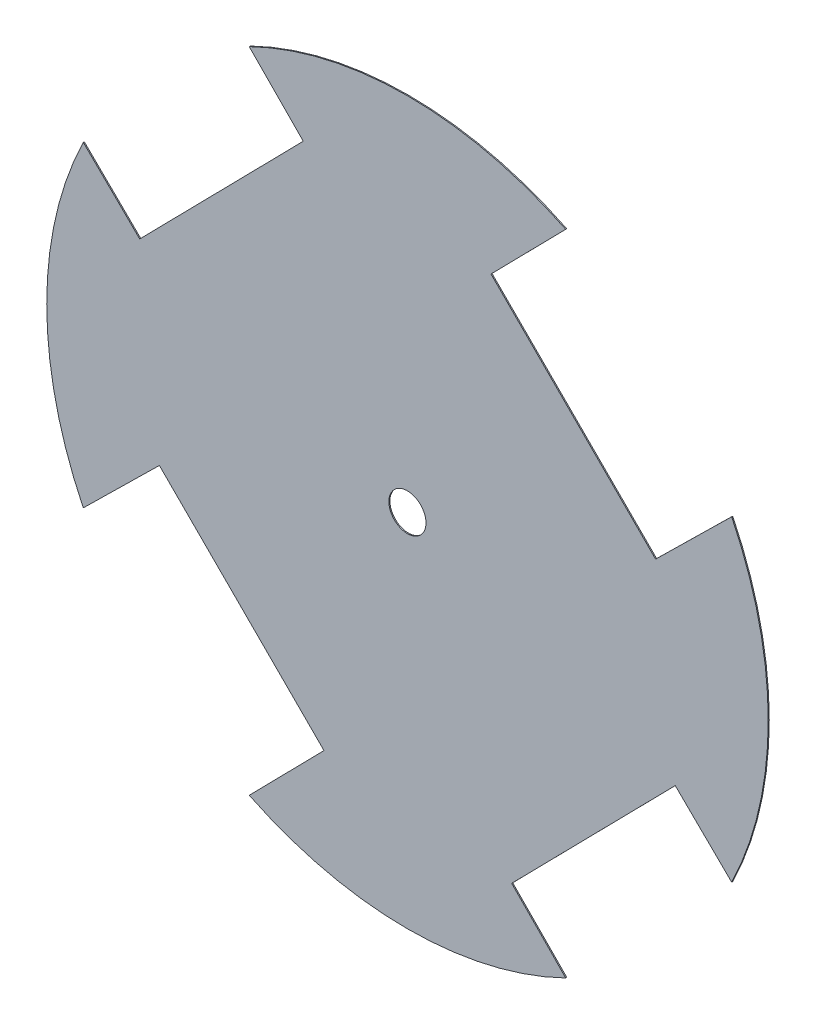
ISO-10303-21;
HEADER;
FILE_DESCRIPTION(('STEP AP214'),'2;1');
FILE_NAME('part.step','',(''),(''),'','','');
FILE_SCHEMA(('AUTOMOTIVE_DESIGN { 1 0 10303 214 1 1 1 1 }'));
ENDSEC;
DATA;
#1=APPLICATION_CONTEXT('core data for automotive mechanical design processes');
#2=APPLICATION_PROTOCOL_DEFINITION('international standard','automotive_design',2000,#1);
#3=PRODUCT_CONTEXT('',#1,'mechanical');
#4=PRODUCT('Part','Part','',(#3));
#5=PRODUCT_RELATED_PRODUCT_CATEGORY('part','',(#4));
#6=PRODUCT_DEFINITION_FORMATION('','',#4);
#7=PRODUCT_DEFINITION_CONTEXT('part definition',#1,'design');
#8=PRODUCT_DEFINITION('design','',#6,#7);
#9=PRODUCT_DEFINITION_SHAPE('','',#8);
#10=(LENGTH_UNIT() NAMED_UNIT(*) SI_UNIT(.MILLI.,.METRE.));
#11=(NAMED_UNIT(*) PLANE_ANGLE_UNIT() SI_UNIT($,.RADIAN.));
#12=(NAMED_UNIT(*) SI_UNIT($,.STERADIAN.) SOLID_ANGLE_UNIT());
#13=UNCERTAINTY_MEASURE_WITH_UNIT(LENGTH_MEASURE(1.E-05),#10,'distance_accuracy_value','');
#14=(GEOMETRIC_REPRESENTATION_CONTEXT(3) GLOBAL_UNCERTAINTY_ASSIGNED_CONTEXT((#13)) GLOBAL_UNIT_ASSIGNED_CONTEXT((#10,
#11,#12)) REPRESENTATION_CONTEXT('',''));
#15=CARTESIAN_POINT('',(0.,0.,0.));
#16=DIRECTION('',(0.,0.,1.));
#17=DIRECTION('',(1.,0.,0.));
#18=AXIS2_PLACEMENT_3D('',#15,#16,#17);
#19=CARTESIAN_POINT('',(0.257754176952285,-1.11022302462516E-13,5.));
#20=DIRECTION('',(0.,0.,-1.));
#21=DIRECTION('',(-1.,0.,0.));
#22=AXIS2_PLACEMENT_3D('',#19,#20,#21);
#23=CYLINDRICAL_SURFACE('',#22,1750.);
#24=CARTESIAN_POINT('',(0.257754176952285,-1.11022302462516E-13,0.));
#25=DIRECTION('',(0.,0.,1.));
#26=DIRECTION('',(1.,0.,0.));
#27=AXIS2_PLACEMENT_3D('',#24,#25,#26);
#28=CIRCLE('',#27,1750.);
#29=CARTESIAN_POINT('',(-767.432407228817,-1572.62577114862,0.));
#30=VERTEX_POINT('',#29);
#31=CARTESIAN_POINT('',(767.947915582713,-1572.62577114862,0.));
#32=VERTEX_POINT('',#31);
#33=EDGE_CURVE('E187',#30,#32,#28,.T.);
#34=ORIENTED_EDGE('',*,*,#33,.T.);
#35=DIRECTION('',(0.,0.,-1.));
#36=VECTOR('',#35,1.);
#37=CARTESIAN_POINT('',(767.947915582713,-1572.62577114862,5.));
#38=LINE('',#37,#36);
#39=CARTESIAN_POINT('',(767.947915582713,-1572.62577114862,5.));
#40=VERTEX_POINT('',#39);
#41=EDGE_CURVE('E11',#40,#32,#38,.T.);
#42=ORIENTED_EDGE('',*,*,#41,.F.);
#43=CARTESIAN_POINT('',(0.257754176952285,-1.11022302462516E-13,5.));
#44=DIRECTION('',(0.,0.,1.));
#45=DIRECTION('',(1.,0.,0.));
#46=AXIS2_PLACEMENT_3D('',#43,#44,#45);
#47=CIRCLE('',#46,1750.);
#48=CARTESIAN_POINT('',(-767.432407228817,-1572.62577114862,5.));
#49=VERTEX_POINT('',#48);
#50=EDGE_CURVE('E234',#49,#40,#47,.T.);
#51=ORIENTED_EDGE('',*,*,#50,.F.);
#52=DIRECTION('',(0.,0.,-1.));
#53=VECTOR('',#52,1.);
#54=CARTESIAN_POINT('',(-767.432407228817,-1572.62577114862,5.));
#55=LINE('',#54,#53);
#56=EDGE_CURVE('E183',#49,#30,#55,.T.);
#57=ORIENTED_EDGE('',*,*,#56,.T.);
#58=EDGE_LOOP('',(#34,#42,#51,#57));
#59=FACE_BOUND('',#58,.T.);
#60=ADVANCED_FACE('F38',(#59),#23,.T.);
#61=CARTESIAN_POINT('',(767.947915582713,-1572.62577114862,5.));
#62=DIRECTION('',(-0.713235928626322,-0.700924040190197,0.));
#63=DIRECTION('',(0.700924040190197,-0.713235928626322,0.));
#64=AXIS2_PLACEMENT_3D('',#61,#62,#63);
#65=PLANE('',#64);
#66=DIRECTION('',(-0.700924040190197,0.713235928626322,0.));
#67=VECTOR('',#66,1.);
#68=CARTESIAN_POINT('',(767.947915582713,-1572.62577114862,0.));
#69=LINE('',#68,#67);
#70=CARTESIAN_POINT('',(505.906479136925,-1305.98151792644,0.));
#71=VERTEX_POINT('',#70);
#72=EDGE_CURVE('E191',#32,#71,#69,.T.);
#73=ORIENTED_EDGE('',*,*,#72,.T.);
#74=DIRECTION('',(0.,0.,-1.));
#75=VECTOR('',#74,1.);
#76=CARTESIAN_POINT('',(505.906479136925,-1305.98151792644,5.));
#77=LINE('',#76,#75);
#78=CARTESIAN_POINT('',(505.906479136925,-1305.98151792644,5.));
#79=VERTEX_POINT('',#78);
#80=EDGE_CURVE('E47',#79,#71,#77,.T.);
#81=ORIENTED_EDGE('',*,*,#80,.F.);
#82=DIRECTION('',(-0.700924040190197,0.713235928626322,0.));
#83=VECTOR('',#82,1.);
#84=CARTESIAN_POINT('',(767.947915582713,-1572.62577114862,5.));
#85=LINE('',#84,#83);
#86=EDGE_CURVE('E122',#40,#79,#85,.T.);
#87=ORIENTED_EDGE('',*,*,#86,.F.);
#88=ORIENTED_EDGE('',*,*,#41,.T.);
#89=EDGE_LOOP('',(#73,#81,#87,#88));
#90=FACE_BOUND('',#89,.T.);
#91=ADVANCED_FACE('F358',(#90),#65,.F.);
#92=CARTESIAN_POINT('',(505.906479136925,-1305.98151792644,5.));
#93=DIRECTION('',(-0.713235928626318,0.700924040190201,0.));
#94=DIRECTION('',(-0.700924040190201,-0.713235928626318,0.));
#95=AXIS2_PLACEMENT_3D('',#92,#93,#94);
#96=PLANE('',#95);
#97=DIRECTION('',(0.700924040190201,0.713235928626318,0.));
#98=VECTOR('',#97,1.);
#99=CARTESIAN_POINT('',(505.906479136925,-1305.98151792644,0.));
#100=LINE('',#99,#98);
#101=CARTESIAN_POINT('',(1299.21132480927,-498.742094188975,0.));
#102=VERTEX_POINT('',#101);
#103=EDGE_CURVE('E195',#71,#102,#100,.T.);
#104=ORIENTED_EDGE('',*,*,#103,.T.);
#105=DIRECTION('',(0.,0.,-1.));
#106=VECTOR('',#105,1.);
#107=CARTESIAN_POINT('',(1299.21132480927,-498.742094188975,5.));
#108=LINE('',#107,#106);
#109=CARTESIAN_POINT('',(1299.21132480927,-498.742094188975,5.));
#110=VERTEX_POINT('',#109);
#111=EDGE_CURVE('E277',#110,#102,#108,.T.);
#112=ORIENTED_EDGE('',*,*,#111,.F.);
#113=DIRECTION('',(0.700924040190201,0.713235928626318,0.));
#114=VECTOR('',#113,1.);
#115=CARTESIAN_POINT('',(505.906479136925,-1305.98151792644,5.));
#116=LINE('',#115,#114);
#117=EDGE_CURVE('E287',#79,#110,#116,.T.);
#118=ORIENTED_EDGE('',*,*,#117,.F.);
#119=ORIENTED_EDGE('',*,*,#80,.T.);
#120=EDGE_LOOP('',(#104,#112,#118,#119));
#121=FACE_BOUND('',#120,.T.);
#122=ADVANCED_FACE('F285',(#121),#96,.F.);
#123=CARTESIAN_POINT('',(1299.21132480927,-498.742094188975,5.));
#124=DIRECTION('',(0.700924040190201,0.713235928626317,0.));
#125=DIRECTION('',(-0.713235928626317,0.700924040190201,0.));
#126=AXIS2_PLACEMENT_3D('',#123,#124,#125);
#127=PLANE('',#126);
#128=DIRECTION('',(0.713235928626317,-0.700924040190201,0.));
#129=VECTOR('',#128,1.);
#130=CARTESIAN_POINT('',(1299.21132480927,-498.742094188975,0.));
#131=LINE('',#130,#129);
#132=CARTESIAN_POINT('',(1572.88352532557,-767.69016140577,0.));
#133=VERTEX_POINT('',#132);
#134=EDGE_CURVE('E198',#102,#133,#131,.T.);
#135=ORIENTED_EDGE('',*,*,#134,.T.);
#136=DIRECTION('',(0.,0.,-1.));
#137=VECTOR('',#136,1.);
#138=CARTESIAN_POINT('',(1572.88352532557,-767.69016140577,5.));
#139=LINE('',#138,#137);
#140=CARTESIAN_POINT('',(1572.88352532557,-767.69016140577,5.));
#141=VERTEX_POINT('',#140);
#142=EDGE_CURVE('E273',#141,#133,#139,.T.);
#143=ORIENTED_EDGE('',*,*,#142,.F.);
#144=DIRECTION('',(0.713235928626317,-0.700924040190201,0.));
#145=VECTOR('',#144,1.);
#146=CARTESIAN_POINT('',(1299.21132480927,-498.742094188975,5.));
#147=LINE('',#146,#145);
#148=EDGE_CURVE('E306',#110,#141,#147,.T.);
#149=ORIENTED_EDGE('',*,*,#148,.F.);
#150=ORIENTED_EDGE('',*,*,#111,.T.);
#151=EDGE_LOOP('',(#135,#143,#149,#150));
#152=FACE_BOUND('',#151,.T.);
#153=ADVANCED_FACE('F296',(#152),#127,.F.);
#154=CARTESIAN_POINT('',(0.257754176952285,-1.11022302462516E-13,5.));
#155=DIRECTION('',(0.,0.,-1.));
#156=DIRECTION('',(-1.,0.,0.));
#157=AXIS2_PLACEMENT_3D('',#154,#155,#156);
#158=CYLINDRICAL_SURFACE('',#157,1750.);
#159=CARTESIAN_POINT('',(0.257754176952285,-1.11022302462516E-13,0.));
#160=DIRECTION('',(0.,0.,1.));
#161=DIRECTION('',(1.,0.,0.));
#162=AXIS2_PLACEMENT_3D('',#159,#160,#161);
#163=CIRCLE('',#162,1750.);
#164=CARTESIAN_POINT('',(1572.88352532565,767.690161405613,0.));
#165=VERTEX_POINT('',#164);
#166=EDGE_CURVE('E201',#133,#165,#163,.T.);
#167=ORIENTED_EDGE('',*,*,#166,.T.);
#168=DIRECTION('',(0.,0.,-1.));
#169=VECTOR('',#168,1.);
#170=CARTESIAN_POINT('',(1572.88352532565,767.690161405613,5.));
#171=LINE('',#170,#169);
#172=CARTESIAN_POINT('',(1572.88352532565,767.690161405613,5.));
#173=VERTEX_POINT('',#172);
#174=EDGE_CURVE('E269',#173,#165,#171,.T.);
#175=ORIENTED_EDGE('',*,*,#174,.F.);
#176=CARTESIAN_POINT('',(0.257754176952285,-1.11022302462516E-13,5.));
#177=DIRECTION('',(0.,0.,1.));
#178=DIRECTION('',(1.,0.,0.));
#179=AXIS2_PLACEMENT_3D('',#176,#177,#178);
#180=CIRCLE('',#179,1750.);
#181=EDGE_CURVE('E302',#141,#173,#180,.T.);
#182=ORIENTED_EDGE('',*,*,#181,.F.);
#183=ORIENTED_EDGE('',*,*,#142,.T.);
#184=EDGE_LOOP('',(#167,#175,#182,#183));
#185=FACE_BOUND('',#184,.T.);
#186=ADVANCED_FACE('F300',(#185),#158,.T.);
#187=CARTESIAN_POINT('',(1572.88352532565,767.690161405613,5.));
#188=DIRECTION('',(0.700924040190196,-0.713235928626322,0.));
#189=DIRECTION('',(0.713235928626322,0.700924040190197,0.));
#190=AXIS2_PLACEMENT_3D('',#187,#188,#189);
#191=PLANE('',#190);
#192=DIRECTION('',(-0.713235928626322,-0.700924040190196,0.));
#193=VECTOR('',#192,1.);
#194=CARTESIAN_POINT('',(1572.88352532565,767.690161405613,0.));
#195=LINE('',#194,#193);
#196=CARTESIAN_POINT('',(1203.82957372892,405.006824210943,0.));
#197=VERTEX_POINT('',#196);
#198=EDGE_CURVE('E204',#165,#197,#195,.T.);
#199=ORIENTED_EDGE('',*,*,#198,.T.);
#200=DIRECTION('',(0.,0.,-1.));
#201=VECTOR('',#200,1.);
#202=CARTESIAN_POINT('',(1203.82957372892,405.006824210943,5.));
#203=LINE('',#202,#201);
#204=CARTESIAN_POINT('',(1203.82957372892,405.006824210943,5.));
#205=VERTEX_POINT('',#204);
#206=EDGE_CURVE('E265',#205,#197,#203,.T.);
#207=ORIENTED_EDGE('',*,*,#206,.F.);
#208=DIRECTION('',(-0.713235928626322,-0.700924040190196,0.));
#209=VECTOR('',#208,1.);
#210=CARTESIAN_POINT('',(1572.88352532565,767.690161405613,5.));
#211=LINE('',#210,#209);
#212=EDGE_CURVE('E305',#173,#205,#211,.T.);
#213=ORIENTED_EDGE('',*,*,#212,.F.);
#214=ORIENTED_EDGE('',*,*,#174,.T.);
#215=EDGE_LOOP('',(#199,#207,#213,#214));
#216=FACE_BOUND('',#215,.T.);
#217=ADVANCED_FACE('F371',(#216),#191,.F.);
#218=CARTESIAN_POINT('',(1203.82957372892,405.006824210943,5.));
#219=DIRECTION('',(-0.707106781186547,-0.707106781186548,0.));
#220=DIRECTION('',(0.707106781186548,-0.707106781186547,0.));
#221=AXIS2_PLACEMENT_3D('',#218,#219,#220);
#222=PLANE('',#221);
#223=DIRECTION('',(-0.707106781186548,0.707106781186547,0.));
#224=VECTOR('',#223,1.);
#225=CARTESIAN_POINT('',(1203.82957372892,405.006824210943,0.));
#226=LINE('',#225,#224);
#227=CARTESIAN_POINT('',(405.264578388122,1203.57181955174,0.));
#228=VERTEX_POINT('',#227);
#229=EDGE_CURVE('E207',#197,#228,#226,.T.);
#230=ORIENTED_EDGE('',*,*,#229,.T.);
#231=DIRECTION('',(0.,0.,-1.));
#232=VECTOR('',#231,1.);
#233=CARTESIAN_POINT('',(405.264578388122,1203.57181955174,5.));
#234=LINE('',#233,#232);
#235=CARTESIAN_POINT('',(405.264578388122,1203.57181955174,5.));
#236=VERTEX_POINT('',#235);
#237=EDGE_CURVE('E261',#236,#228,#234,.T.);
#238=ORIENTED_EDGE('',*,*,#237,.F.);
#239=DIRECTION('',(-0.707106781186548,0.707106781186547,0.));
#240=VECTOR('',#239,1.);
#241=CARTESIAN_POINT('',(1203.82957372892,405.006824210943,5.));
#242=LINE('',#241,#240);
#243=EDGE_CURVE('E310',#205,#236,#242,.T.);
#244=ORIENTED_EDGE('',*,*,#243,.F.);
#245=ORIENTED_EDGE('',*,*,#206,.T.);
#246=EDGE_LOOP('',(#230,#238,#244,#245));
#247=FACE_BOUND('',#246,.T.);
#248=ADVANCED_FACE('F374',(#247),#222,.F.);
#249=CARTESIAN_POINT('',(405.264578388122,1203.57181955174,5.));
#250=DIRECTION('',(-0.713235928626318,0.7009240401902,0.));
#251=DIRECTION('',(-0.7009240401902,-0.713235928626318,0.));
#252=AXIS2_PLACEMENT_3D('',#249,#250,#251);
#253=PLANE('',#252);
#254=DIRECTION('',(0.7009240401902,0.713235928626318,0.));
#255=VECTOR('',#254,1.);
#256=CARTESIAN_POINT('',(405.264578388122,1203.57181955174,0.));
#257=LINE('',#256,#255);
#258=CARTESIAN_POINT('',(767.947915582871,1572.62577114854,0.));
#259=VERTEX_POINT('',#258);
#260=EDGE_CURVE('E210',#228,#259,#257,.T.);
#261=ORIENTED_EDGE('',*,*,#260,.T.);
#262=DIRECTION('',(0.,0.,-1.));
#263=VECTOR('',#262,1.);
#264=CARTESIAN_POINT('',(767.947915582871,1572.62577114854,5.));
#265=LINE('',#264,#263);
#266=CARTESIAN_POINT('',(767.947915582871,1572.62577114854,5.));
#267=VERTEX_POINT('',#266);
#268=EDGE_CURVE('E257',#267,#259,#265,.T.);
#269=ORIENTED_EDGE('',*,*,#268,.F.);
#270=DIRECTION('',(0.7009240401902,0.713235928626318,0.));
#271=VECTOR('',#270,1.);
#272=CARTESIAN_POINT('',(405.264578388122,1203.57181955174,5.));
#273=LINE('',#272,#271);
#274=EDGE_CURVE('E317',#236,#267,#273,.T.);
#275=ORIENTED_EDGE('',*,*,#274,.F.);
#276=ORIENTED_EDGE('',*,*,#237,.T.);
#277=EDGE_LOOP('',(#261,#269,#275,#276));
#278=FACE_BOUND('',#277,.T.);
#279=ADVANCED_FACE('F378',(#278),#253,.F.);
#280=CARTESIAN_POINT('',(0.257754176952285,-1.11022302462516E-13,5.));
#281=DIRECTION('',(0.,0.,-1.));
#282=DIRECTION('',(-1.,0.,0.));
#283=AXIS2_PLACEMENT_3D('',#280,#281,#282);
#284=CYLINDRICAL_SURFACE('',#283,1750.);
#285=CARTESIAN_POINT('',(0.257754176952285,-1.11022302462516E-13,0.));
#286=DIRECTION('',(0.,0.,1.));
#287=DIRECTION('',(1.,0.,0.));
#288=AXIS2_PLACEMENT_3D('',#285,#286,#287);
#289=CIRCLE('',#288,1750.);
#290=CARTESIAN_POINT('',(-767.432407228796,1572.62577114863,0.));
#291=VERTEX_POINT('',#290);
#292=EDGE_CURVE('E213',#259,#291,#289,.T.);
#293=ORIENTED_EDGE('',*,*,#292,.T.);
#294=DIRECTION('',(0.,0.,-1.));
#295=VECTOR('',#294,1.);
#296=CARTESIAN_POINT('',(-767.432407228796,1572.62577114863,5.));
#297=LINE('',#296,#295);
#298=CARTESIAN_POINT('',(-767.432407228796,1572.62577114863,5.));
#299=VERTEX_POINT('',#298);
#300=EDGE_CURVE('E253',#299,#291,#297,.T.);
#301=ORIENTED_EDGE('',*,*,#300,.F.);
#302=CARTESIAN_POINT('',(0.257754176952285,-1.11022302462516E-13,5.));
#303=DIRECTION('',(0.,0.,1.));
#304=DIRECTION('',(1.,0.,0.));
#305=AXIS2_PLACEMENT_3D('',#302,#303,#304);
#306=CIRCLE('',#305,1750.);
#307=EDGE_CURVE('E320',#267,#299,#306,.T.);
#308=ORIENTED_EDGE('',*,*,#307,.F.);
#309=ORIENTED_EDGE('',*,*,#268,.T.);
#310=EDGE_LOOP('',(#293,#301,#308,#309));
#311=FACE_BOUND('',#310,.T.);
#312=ADVANCED_FACE('F382',(#311),#284,.T.);
#313=CARTESIAN_POINT('',(-767.432407228797,1572.62577114863,5.));
#314=DIRECTION('',(0.713235928626327,0.700924040190192,0.));
#315=DIRECTION('',(-0.700924040190192,0.713235928626327,0.));
#316=AXIS2_PLACEMENT_3D('',#313,#314,#315);
#317=PLANE('',#316);
#318=DIRECTION('',(0.700924040190192,-0.713235928626327,0.));
#319=VECTOR('',#318,1.);
#320=CARTESIAN_POINT('',(-767.432407228797,1572.62577114863,0.));
#321=LINE('',#320,#319);
#322=CARTESIAN_POINT('',(-505.39097078301,1305.98151792645,0.));
#323=VERTEX_POINT('',#322);
#324=EDGE_CURVE('E216',#291,#323,#321,.T.);
#325=ORIENTED_EDGE('',*,*,#324,.T.);
#326=DIRECTION('',(0.,0.,-1.));
#327=VECTOR('',#326,1.);
#328=CARTESIAN_POINT('',(-505.39097078301,1305.98151792645,5.));
#329=LINE('',#328,#327);
#330=CARTESIAN_POINT('',(-505.39097078301,1305.98151792645,5.));
#331=VERTEX_POINT('',#330);
#332=EDGE_CURVE('E249',#331,#323,#329,.T.);
#333=ORIENTED_EDGE('',*,*,#332,.F.);
#334=DIRECTION('',(0.700924040190192,-0.713235928626327,0.));
#335=VECTOR('',#334,1.);
#336=CARTESIAN_POINT('',(-767.432407228797,1572.62577114863,5.));
#337=LINE('',#336,#335);
#338=EDGE_CURVE('E323',#299,#331,#337,.T.);
#339=ORIENTED_EDGE('',*,*,#338,.F.);
#340=ORIENTED_EDGE('',*,*,#300,.T.);
#341=EDGE_LOOP('',(#325,#333,#339,#340));
#342=FACE_BOUND('',#341,.T.);
#343=ADVANCED_FACE('F386',(#342),#317,.F.);
#344=CARTESIAN_POINT('',(-505.39097078301,1305.98151792645,5.));
#345=DIRECTION('',(0.713235928626313,-0.700924040190206,0.));
#346=DIRECTION('',(0.700924040190206,0.713235928626313,0.));
#347=AXIS2_PLACEMENT_3D('',#344,#345,#346);
#348=PLANE('',#347);
#349=DIRECTION('',(-0.700924040190206,-0.713235928626313,0.));
#350=VECTOR('',#349,1.);
#351=CARTESIAN_POINT('',(-505.39097078301,1305.98151792645,0.));
#352=LINE('',#351,#350);
#353=CARTESIAN_POINT('',(-1298.69581645537,498.742094188982,0.));
#354=VERTEX_POINT('',#353);
#355=EDGE_CURVE('E219',#323,#354,#352,.T.);
#356=ORIENTED_EDGE('',*,*,#355,.T.);
#357=DIRECTION('',(0.,0.,-1.));
#358=VECTOR('',#357,1.);
#359=CARTESIAN_POINT('',(-1298.69581645537,498.742094188982,5.));
#360=LINE('',#359,#358);
#361=CARTESIAN_POINT('',(-1298.69581645537,498.742094188982,5.));
#362=VERTEX_POINT('',#361);
#363=EDGE_CURVE('E245',#362,#354,#360,.T.);
#364=ORIENTED_EDGE('',*,*,#363,.F.);
#365=DIRECTION('',(-0.700924040190206,-0.713235928626313,0.));
#366=VECTOR('',#365,1.);
#367=CARTESIAN_POINT('',(-505.39097078301,1305.98151792645,5.));
#368=LINE('',#367,#366);
#369=EDGE_CURVE('E326',#331,#362,#368,.T.);
#370=ORIENTED_EDGE('',*,*,#369,.F.);
#371=ORIENTED_EDGE('',*,*,#332,.T.);
#372=EDGE_LOOP('',(#356,#364,#370,#371));
#373=FACE_BOUND('',#372,.T.);
#374=ADVANCED_FACE('F390',(#373),#348,.F.);
#375=CARTESIAN_POINT('',(-1298.69581645537,498.742094188982,5.));
#376=DIRECTION('',(-0.700924040190206,-0.713235928626312,0.));
#377=DIRECTION('',(0.713235928626312,-0.700924040190206,0.));
#378=AXIS2_PLACEMENT_3D('',#375,#376,#377);
#379=PLANE('',#378);
#380=DIRECTION('',(-0.713235928626312,0.700924040190206,0.));
#381=VECTOR('',#380,1.);
#382=CARTESIAN_POINT('',(-1298.69581645537,498.742094188982,0.));
#383=LINE('',#382,#381);
#384=CARTESIAN_POINT('',(-1572.36801697166,767.690161405779,0.));
#385=VERTEX_POINT('',#384);
#386=EDGE_CURVE('E222',#354,#385,#383,.T.);
#387=ORIENTED_EDGE('',*,*,#386,.T.);
#388=DIRECTION('',(0.,0.,-1.));
#389=VECTOR('',#388,1.);
#390=CARTESIAN_POINT('',(-1572.36801697166,767.690161405779,5.));
#391=LINE('',#390,#389);
#392=CARTESIAN_POINT('',(-1572.36801697166,767.690161405779,5.));
#393=VERTEX_POINT('',#392);
#394=EDGE_CURVE('E241',#393,#385,#391,.T.);
#395=ORIENTED_EDGE('',*,*,#394,.F.);
#396=DIRECTION('',(-0.713235928626312,0.700924040190206,0.));
#397=VECTOR('',#396,1.);
#398=CARTESIAN_POINT('',(-1298.69581645537,498.742094188982,5.));
#399=LINE('',#398,#397);
#400=EDGE_CURVE('E329',#362,#393,#399,.T.);
#401=ORIENTED_EDGE('',*,*,#400,.F.);
#402=ORIENTED_EDGE('',*,*,#363,.T.);
#403=EDGE_LOOP('',(#387,#395,#401,#402));
#404=FACE_BOUND('',#403,.T.);
#405=ADVANCED_FACE('F337',(#404),#379,.F.);
#406=CARTESIAN_POINT('',(0.257754176952285,-1.11022302462516E-13,5.));
#407=DIRECTION('',(0.,0.,-1.));
#408=DIRECTION('',(-1.,0.,0.));
#409=AXIS2_PLACEMENT_3D('',#406,#407,#408);
#410=CYLINDRICAL_SURFACE('',#409,1750.);
#411=CARTESIAN_POINT('',(0.257754176952285,-1.11022302462516E-13,0.));
#412=DIRECTION('',(0.,0.,1.));
#413=DIRECTION('',(1.,0.,0.));
#414=AXIS2_PLACEMENT_3D('',#411,#412,#413);
#415=CIRCLE('',#414,1750.);
#416=CARTESIAN_POINT('',(-1572.36801697167,-767.690161405758,0.));
#417=VERTEX_POINT('',#416);
#418=EDGE_CURVE('E225',#385,#417,#415,.T.);
#419=ORIENTED_EDGE('',*,*,#418,.T.);
#420=DIRECTION('',(0.,0.,-1.));
#421=VECTOR('',#420,1.);
#422=CARTESIAN_POINT('',(-1572.36801697167,-767.690161405758,5.));
#423=LINE('',#422,#421);
#424=CARTESIAN_POINT('',(-1572.36801697167,-767.690161405758,5.));
#425=VERTEX_POINT('',#424);
#426=EDGE_CURVE('E176',#425,#417,#423,.T.);
#427=ORIENTED_EDGE('',*,*,#426,.F.);
#428=CARTESIAN_POINT('',(0.257754176952285,-1.11022302462516E-13,5.));
#429=DIRECTION('',(0.,0.,1.));
#430=DIRECTION('',(1.,0.,0.));
#431=AXIS2_PLACEMENT_3D('',#428,#429,#430);
#432=CIRCLE('',#431,1750.);
#433=EDGE_CURVE('E165',#393,#425,#432,.T.);
#434=ORIENTED_EDGE('',*,*,#433,.F.);
#435=ORIENTED_EDGE('',*,*,#394,.T.);
#436=EDGE_LOOP('',(#419,#427,#434,#435));
#437=FACE_BOUND('',#436,.T.);
#438=ADVANCED_FACE('F341',(#437),#410,.T.);
#439=CARTESIAN_POINT('',(-1572.36801697167,-767.690161405759,5.));
#440=DIRECTION('',(-0.700924040190197,0.713235928626322,0.));
#441=DIRECTION('',(-0.713235928626322,-0.700924040190197,0.));
#442=AXIS2_PLACEMENT_3D('',#439,#440,#441);
#443=PLANE('',#442);
#444=DIRECTION('',(0.713235928626322,0.700924040190197,0.));
#445=VECTOR('',#444,1.);
#446=CARTESIAN_POINT('',(-1572.36801697167,-767.690161405759,0.));
#447=LINE('',#446,#445);
#448=CARTESIAN_POINT('',(-1203.31406537479,-405.006824210941,0.));
#449=VERTEX_POINT('',#448);
#450=EDGE_CURVE('E174',#417,#449,#447,.T.);
#451=ORIENTED_EDGE('',*,*,#450,.T.);
#452=DIRECTION('',(0.,0.,-1.));
#453=VECTOR('',#452,1.);
#454=CARTESIAN_POINT('',(-1203.31406537479,-405.006824210941,5.));
#455=LINE('',#454,#453);
#456=CARTESIAN_POINT('',(-1203.31406537479,-405.006824210941,5.));
#457=VERTEX_POINT('',#456);
#458=EDGE_CURVE('E171',#457,#449,#455,.T.);
#459=ORIENTED_EDGE('',*,*,#458,.F.);
#460=DIRECTION('',(0.713235928626322,0.700924040190197,0.));
#461=VECTOR('',#460,1.);
#462=CARTESIAN_POINT('',(-1572.36801697167,-767.690161405759,5.));
#463=LINE('',#462,#461);
#464=EDGE_CURVE('E159',#425,#457,#463,.T.);
#465=ORIENTED_EDGE('',*,*,#464,.F.);
#466=ORIENTED_EDGE('',*,*,#426,.T.);
#467=EDGE_LOOP('',(#451,#459,#465,#466));
#468=FACE_BOUND('',#467,.T.);
#469=ADVANCED_FACE('F172',(#468),#443,.F.);
#470=CARTESIAN_POINT('',(-1203.31406537479,-405.006824210941,5.));
#471=DIRECTION('',(0.70710678118655,0.707106781186545,0.));
#472=DIRECTION('',(-0.707106781186545,0.70710678118655,0.));
#473=AXIS2_PLACEMENT_3D('',#470,#471,#472);
#474=PLANE('',#473);
#475=DIRECTION('',(0.707106781186545,-0.70710678118655,0.));
#476=VECTOR('',#475,1.);
#477=CARTESIAN_POINT('',(-1203.31406537479,-405.006824210941,0.));
#478=LINE('',#477,#476);
#479=CARTESIAN_POINT('',(-404.749070033996,-1203.57181955174,0.));
#480=VERTEX_POINT('',#479);
#481=EDGE_CURVE('E108',#449,#480,#478,.T.);
#482=ORIENTED_EDGE('',*,*,#481,.T.);
#483=DIRECTION('',(0.,0.,-1.));
#484=VECTOR('',#483,1.);
#485=CARTESIAN_POINT('',(-404.749070033996,-1203.57181955174,5.));
#486=LINE('',#485,#484);
#487=CARTESIAN_POINT('',(-404.749070033996,-1203.57181955174,5.));
#488=VERTEX_POINT('',#487);
#489=EDGE_CURVE('E177',#488,#480,#486,.T.);
#490=ORIENTED_EDGE('',*,*,#489,.F.);
#491=DIRECTION('',(0.707106781186545,-0.70710678118655,0.));
#492=VECTOR('',#491,1.);
#493=CARTESIAN_POINT('',(-1203.31406537479,-405.006824210941,5.));
#494=LINE('',#493,#492);
#495=EDGE_CURVE('E163',#457,#488,#494,.T.);
#496=ORIENTED_EDGE('',*,*,#495,.F.);
#497=ORIENTED_EDGE('',*,*,#458,.T.);
#498=EDGE_LOOP('',(#482,#490,#496,#497));
#499=FACE_BOUND('',#498,.T.);
#500=ADVANCED_FACE('F179',(#499),#474,.F.);
#501=CARTESIAN_POINT('',(-404.749070033996,-1203.57181955174,5.));
#502=DIRECTION('',(0.713235928626318,-0.700924040190201,0.));
#503=DIRECTION('',(0.700924040190201,0.713235928626318,0.));
#504=AXIS2_PLACEMENT_3D('',#501,#502,#503);
#505=PLANE('',#504);
#506=DIRECTION('',(-0.700924040190201,-0.713235928626318,0.));
#507=VECTOR('',#506,1.);
#508=CARTESIAN_POINT('',(-404.749070033996,-1203.57181955174,0.));
#509=LINE('',#508,#507);
#510=EDGE_CURVE('E114',#480,#30,#509,.T.);
#511=ORIENTED_EDGE('',*,*,#510,.T.);
#512=ORIENTED_EDGE('',*,*,#56,.F.);
#513=DIRECTION('',(-0.700924040190201,-0.713235928626318,0.));
#514=VECTOR('',#513,1.);
#515=CARTESIAN_POINT('',(-404.749070033996,-1203.57181955174,5.));
#516=LINE('',#515,#514);
#517=EDGE_CURVE('E55',#488,#49,#516,.T.);
#518=ORIENTED_EDGE('',*,*,#517,.F.);
#519=ORIENTED_EDGE('',*,*,#489,.T.);
#520=EDGE_LOOP('',(#511,#512,#518,#519));
#521=FACE_BOUND('',#520,.T.);
#522=ADVANCED_FACE('F345',(#521),#505,.F.);
#523=CARTESIAN_POINT('',(0.257754176952285,-1.11022302462516E-13,5.));
#524=DIRECTION('',(0.,0.,1.));
#525=DIRECTION('',(1.,0.,0.));
#526=AXIS2_PLACEMENT_3D('',#523,#524,#525);
#527=PLANE('',#526);
#528=CARTESIAN_POINT('',(0.,-7.68125894545489E-12,5.));
#529=DIRECTION('',(0.,0.,1.));
#530=DIRECTION('',(1.,0.,0.));
#531=AXIS2_PLACEMENT_3D('',#528,#529,#530);
#532=CIRCLE('',#531,90.);
#533=CARTESIAN_POINT('',(90.,-7.68125894545489E-12,5.));
#534=VERTEX_POINT('',#533);
#535=EDGE_CURVE('E192',#534,#534,#532,.F.);
#536=ORIENTED_EDGE('',*,*,#535,.T.);
#537=EDGE_LOOP('',(#536));
#538=FACE_BOUND('',#537,.T.);
#539=ORIENTED_EDGE('',*,*,#50,.T.);
#540=ORIENTED_EDGE('',*,*,#86,.T.);
#541=ORIENTED_EDGE('',*,*,#117,.T.);
#542=ORIENTED_EDGE('',*,*,#148,.T.);
#543=ORIENTED_EDGE('',*,*,#181,.T.);
#544=ORIENTED_EDGE('',*,*,#212,.T.);
#545=ORIENTED_EDGE('',*,*,#243,.T.);
#546=ORIENTED_EDGE('',*,*,#274,.T.);
#547=ORIENTED_EDGE('',*,*,#307,.T.);
#548=ORIENTED_EDGE('',*,*,#338,.T.);
#549=ORIENTED_EDGE('',*,*,#369,.T.);
#550=ORIENTED_EDGE('',*,*,#400,.T.);
#551=ORIENTED_EDGE('',*,*,#433,.T.);
#552=ORIENTED_EDGE('',*,*,#464,.T.);
#553=ORIENTED_EDGE('',*,*,#495,.T.);
#554=ORIENTED_EDGE('',*,*,#517,.T.);
#555=EDGE_LOOP('',(#539,#540,#541,#542,#543,#544,#545,#546,#547,#548,#549,#550,#551,#552,#553,#554));
#556=FACE_BOUND('',#555,.T.);
#557=ADVANCED_FACE('F161',(#538,#556),#527,.T.);
#558=CARTESIAN_POINT('',(0.257754176952285,-1.11022302462516E-13,0.));
#559=DIRECTION('',(0.,0.,1.));
#560=DIRECTION('',(1.,0.,0.));
#561=AXIS2_PLACEMENT_3D('',#558,#559,#560);
#562=PLANE('',#561);
#563=CARTESIAN_POINT('',(0.,-7.68125894545489E-12,0.));
#564=DIRECTION('',(0.,0.,1.));
#565=DIRECTION('',(1.,0.,0.));
#566=AXIS2_PLACEMENT_3D('',#563,#564,#565);
#567=CIRCLE('',#566,90.);
#568=CARTESIAN_POINT('',(90.,-7.68125894545489E-12,0.));
#569=VERTEX_POINT('',#568);
#570=EDGE_CURVE('E444',#569,#569,#567,.T.);
#571=ORIENTED_EDGE('',*,*,#570,.T.);
#572=EDGE_LOOP('',(#571));
#573=FACE_BOUND('',#572,.T.);
#574=ORIENTED_EDGE('',*,*,#33,.F.);
#575=ORIENTED_EDGE('',*,*,#510,.F.);
#576=ORIENTED_EDGE('',*,*,#481,.F.);
#577=ORIENTED_EDGE('',*,*,#450,.F.);
#578=ORIENTED_EDGE('',*,*,#418,.F.);
#579=ORIENTED_EDGE('',*,*,#386,.F.);
#580=ORIENTED_EDGE('',*,*,#355,.F.);
#581=ORIENTED_EDGE('',*,*,#324,.F.);
#582=ORIENTED_EDGE('',*,*,#292,.F.);
#583=ORIENTED_EDGE('',*,*,#260,.F.);
#584=ORIENTED_EDGE('',*,*,#229,.F.);
#585=ORIENTED_EDGE('',*,*,#198,.F.);
#586=ORIENTED_EDGE('',*,*,#166,.F.);
#587=ORIENTED_EDGE('',*,*,#134,.F.);
#588=ORIENTED_EDGE('',*,*,#103,.F.);
#589=ORIENTED_EDGE('',*,*,#72,.F.);
#590=EDGE_LOOP('',(#574,#575,#576,#577,#578,#579,#580,#581,#582,#583,#584,#585,#586,#587,#588,#589));
#591=FACE_BOUND('',#590,.T.);
#592=ADVANCED_FACE('F291',(#573,#591),#562,.F.);
#593=CARTESIAN_POINT('',(0.,-7.68125894545489E-12,10.));
#594=DIRECTION('',(0.,0.,-1.));
#595=DIRECTION('',(-1.,0.,0.));
#596=AXIS2_PLACEMENT_3D('',#593,#594,#595);
#597=CYLINDRICAL_SURFACE('',#596,90.);
#598=ORIENTED_EDGE('',*,*,#535,.F.);
#599=EDGE_LOOP('',(#598));
#600=FACE_BOUND('',#599,.T.);
#601=ORIENTED_EDGE('',*,*,#570,.F.);
#602=EDGE_LOOP('',(#601));
#603=FACE_BOUND('',#602,.T.);
#604=ADVANCED_FACE('F423',(#600,#603),#597,.F.);
#605=CLOSED_SHELL('',(#60,#91,#122,#153,#186,#217,#248,#279,#312,#343,#374,#405,#438,#469,#500,
#522,#557,#592,#604));
#606=MANIFOLD_SOLID_BREP('B2',#605);
#607=ADVANCED_BREP_SHAPE_REPRESENTATION('',(#18,#606),#14);
#608=SHAPE_DEFINITION_REPRESENTATION(#9,#607);
ENDSEC;
END-ISO-10303-21;
